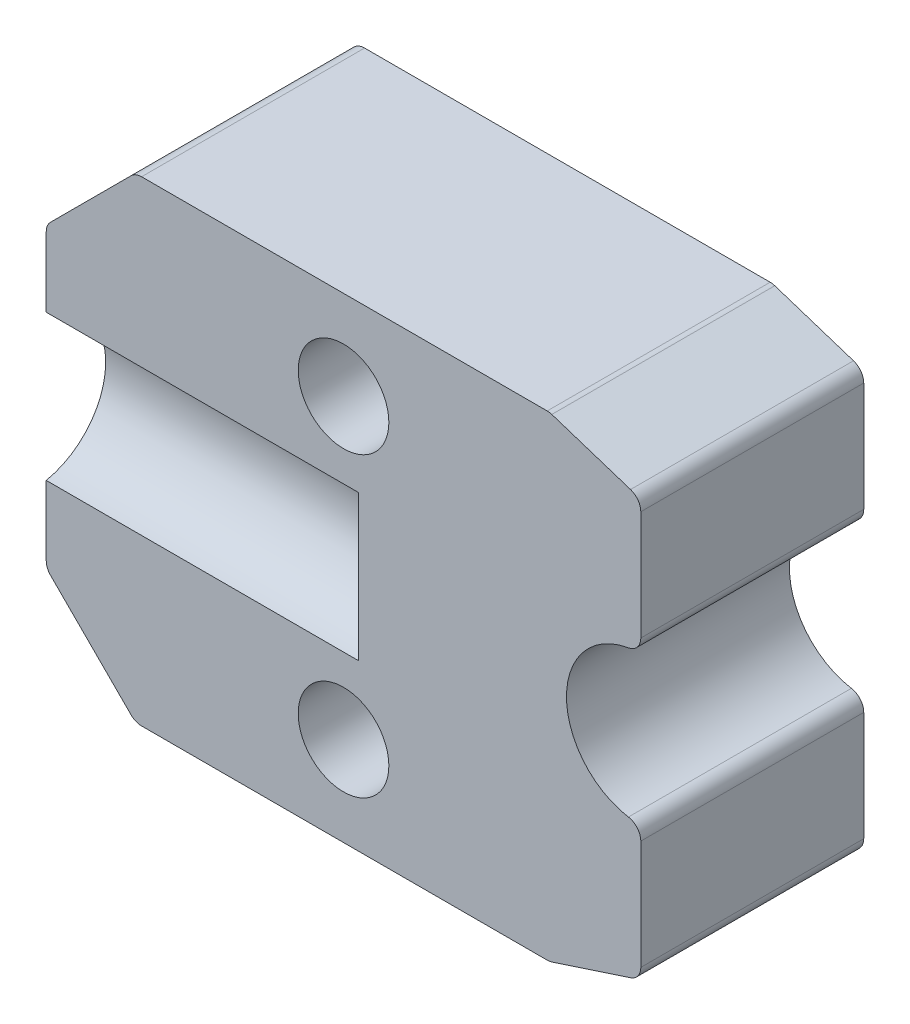
ISO-10303-21;
HEADER;
FILE_DESCRIPTION(('STEP AP214'),'2;1');
FILE_NAME('part.step','',(''),(''),'','','');
FILE_SCHEMA(('AUTOMOTIVE_DESIGN { 1 0 10303 214 1 1 1 1 }'));
ENDSEC;
DATA;
#1=APPLICATION_CONTEXT('core data for automotive mechanical design processes');
#2=APPLICATION_PROTOCOL_DEFINITION('international standard','automotive_design',2000,#1);
#3=PRODUCT_CONTEXT('',#1,'mechanical');
#4=PRODUCT('Part','Part','',(#3));
#5=PRODUCT_RELATED_PRODUCT_CATEGORY('part','',(#4));
#6=PRODUCT_DEFINITION_FORMATION('','',#4);
#7=PRODUCT_DEFINITION_CONTEXT('part definition',#1,'design');
#8=PRODUCT_DEFINITION('design','',#6,#7);
#9=PRODUCT_DEFINITION_SHAPE('','',#8);
#10=(LENGTH_UNIT() NAMED_UNIT(*) SI_UNIT(.MILLI.,.METRE.));
#11=(NAMED_UNIT(*) PLANE_ANGLE_UNIT() SI_UNIT($,.RADIAN.));
#12=(NAMED_UNIT(*) SI_UNIT($,.STERADIAN.) SOLID_ANGLE_UNIT());
#13=UNCERTAINTY_MEASURE_WITH_UNIT(LENGTH_MEASURE(1.E-05),#10,'distance_accuracy_value','');
#14=(GEOMETRIC_REPRESENTATION_CONTEXT(3) GLOBAL_UNCERTAINTY_ASSIGNED_CONTEXT((#13)) GLOBAL_UNIT_ASSIGNED_CONTEXT((#10,
#11,#12)) REPRESENTATION_CONTEXT('',''));
#15=CARTESIAN_POINT('',(0.,0.,0.));
#16=DIRECTION('',(0.,0.,1.));
#17=DIRECTION('',(1.,0.,0.));
#18=AXIS2_PLACEMENT_3D('',#15,#16,#17);
#19=CARTESIAN_POINT('',(10.,-7.,3.75));
#20=DIRECTION('',(-1.,0.,0.));
#21=DIRECTION('',(0.,0.,1.));
#22=AXIS2_PLACEMENT_3D('',#19,#20,#21);
#23=PLANE('',#22);
#24=DIRECTION('',(0.,1.,0.));
#25=VECTOR('',#24,1.);
#26=CARTESIAN_POINT('',(10.,-7.,-3.75));
#27=LINE('',#26,#25);
#28=CARTESIAN_POINT('',(10.,2.95803989154981,-3.75));
#29=VERTEX_POINT('',#28);
#30=CARTESIAN_POINT('',(10.,6.63706018608948,-3.75));
#31=VERTEX_POINT('',#30);
#32=EDGE_CURVE('E248',#29,#31,#27,.T.);
#33=ORIENTED_EDGE('',*,*,#32,.T.);
#34=DIRECTION('',(0.,0.,-1.));
#35=VECTOR('',#34,1.);
#36=CARTESIAN_POINT('',(10.,6.63706018608948,3.75));
#37=LINE('',#36,#35);
#38=CARTESIAN_POINT('',(10.,6.63706018608948,3.75));
#39=VERTEX_POINT('',#38);
#40=EDGE_CURVE('E299',#31,#39,#37,.F.);
#41=ORIENTED_EDGE('',*,*,#40,.T.);
#42=DIRECTION('',(0.,1.,0.));
#43=VECTOR('',#42,1.);
#44=CARTESIAN_POINT('',(10.,-7.,3.75));
#45=LINE('',#44,#43);
#46=CARTESIAN_POINT('',(10.,2.95803989154981,3.75));
#47=VERTEX_POINT('',#46);
#48=EDGE_CURVE('E232',#47,#39,#45,.T.);
#49=ORIENTED_EDGE('',*,*,#48,.F.);
#50=DIRECTION('',(0.,0.,-1.));
#51=VECTOR('',#50,1.);
#52=CARTESIAN_POINT('',(10.,2.95803989154981,3.75));
#53=LINE('',#52,#51);
#54=EDGE_CURVE('E296',#47,#29,#53,.T.);
#55=ORIENTED_EDGE('',*,*,#54,.T.);
#56=EDGE_LOOP('',(#33,#41,#49,#55));
#57=FACE_BOUND('',#56,.T.);
#58=ADVANCED_FACE('F37',(#57),#23,.F.);
#59=CARTESIAN_POINT('',(0.,0.,3.75));
#60=DIRECTION('',(0.,0.,1.));
#61=DIRECTION('',(1.,0.,0.));
#62=AXIS2_PLACEMENT_3D('',#59,#60,#61);
#63=PLANE('',#62);
#64=ORIENTED_EDGE('',*,*,#48,.T.);
#65=CARTESIAN_POINT('',(9.5,6.63706018608948,3.75));
#66=DIRECTION('',(0.,0.,1.));
#67=DIRECTION('',(1.,0.,0.));
#68=AXIS2_PLACEMENT_3D('',#65,#66,#67);
#69=CIRCLE('',#68,0.5);
#70=CARTESIAN_POINT('',(9.65492120752581,7.11245414846042,3.75));
#71=VERTEX_POINT('',#70);
#72=EDGE_CURVE('E317',#39,#71,#69,.T.);
#73=ORIENTED_EDGE('',*,*,#72,.T.);
#74=DIRECTION('',(-0.950787924741883,0.309842415051623,0.));
#75=VECTOR('',#74,1.);
#76=CARTESIAN_POINT('',(10.,7.,3.75));
#77=LINE('',#76,#75);
#78=CARTESIAN_POINT('',(7.00688880463988,7.97539396237094,3.75));
#79=VERTEX_POINT('',#78);
#80=EDGE_CURVE('E235',#71,#79,#77,.T.);
#81=ORIENTED_EDGE('',*,*,#80,.T.);
#82=CARTESIAN_POINT('',(6.85196759711407,7.5,3.75));
#83=DIRECTION('',(0.,0.,1.));
#84=DIRECTION('',(1.,0.,0.));
#85=AXIS2_PLACEMENT_3D('',#82,#83,#84);
#86=CIRCLE('',#85,0.5);
#87=CARTESIAN_POINT('',(6.85196759711407,8.,3.75));
#88=VERTEX_POINT('',#87);
#89=EDGE_CURVE('E315',#79,#88,#86,.T.);
#90=ORIENTED_EDGE('',*,*,#89,.T.);
#91=DIRECTION('',(-1.,0.,0.));
#92=VECTOR('',#91,1.);
#93=CARTESIAN_POINT('',(6.93138228159153,8.,3.75));
#94=LINE('',#93,#92);
#95=CARTESIAN_POINT('',(-6.79289321881344,8.,3.75));
#96=VERTEX_POINT('',#95);
#97=EDGE_CURVE('E238',#88,#96,#94,.T.);
#98=ORIENTED_EDGE('',*,*,#97,.T.);
#99=CARTESIAN_POINT('',(-6.79289321881344,7.5,3.75));
#100=DIRECTION('',(0.,0.,1.));
#101=DIRECTION('',(1.,0.,0.));
#102=AXIS2_PLACEMENT_3D('',#99,#100,#101);
#103=CIRCLE('',#102,0.5);
#104=CARTESIAN_POINT('',(-7.14644660940671,7.85355339059327,3.75));
#105=VERTEX_POINT('',#104);
#106=EDGE_CURVE('E313',#96,#105,#103,.T.);
#107=ORIENTED_EDGE('',*,*,#106,.T.);
#108=DIRECTION('',(0.707106781186549,0.707106781186546,0.));
#109=VECTOR('',#108,1.);
#110=CARTESIAN_POINT('',(-7.49999999999998,7.50000000000001,3.75));
#111=LINE('',#110,#109);
#112=CARTESIAN_POINT('',(-9.85355339059327,5.14644660940673,3.75));
#113=VERTEX_POINT('',#112);
#114=EDGE_CURVE('E265',#105,#113,#111,.F.);
#115=ORIENTED_EDGE('',*,*,#114,.T.);
#116=CARTESIAN_POINT('',(-9.5,4.79289321881345,3.75));
#117=DIRECTION('',(0.,0.,1.));
#118=DIRECTION('',(1.,0.,0.));
#119=AXIS2_PLACEMENT_3D('',#116,#117,#118);
#120=CIRCLE('',#119,0.5);
#121=CARTESIAN_POINT('',(-10.,4.79289321881345,3.75));
#122=VERTEX_POINT('',#121);
#123=EDGE_CURVE('E311',#113,#122,#120,.T.);
#124=ORIENTED_EDGE('',*,*,#123,.T.);
#125=DIRECTION('',(0.,-1.,0.));
#126=VECTOR('',#125,1.);
#127=CARTESIAN_POINT('',(-10.,8.,3.75));
#128=LINE('',#127,#126);
#129=CARTESIAN_POINT('',(-10.,2.44948974278318,3.75));
#130=VERTEX_POINT('',#129);
#131=EDGE_CURVE('E195',#122,#130,#128,.T.);
#132=ORIENTED_EDGE('',*,*,#131,.T.);
#133=DIRECTION('',(-1.,0.,0.));
#134=VECTOR('',#133,1.);
#135=CARTESIAN_POINT('',(0.5,2.44948974278318,3.75));
#136=LINE('',#135,#134);
#137=CARTESIAN_POINT('',(0.5,2.44948974278318,3.75));
#138=VERTEX_POINT('',#137);
#139=EDGE_CURVE('E200',#138,#130,#136,.T.);
#140=ORIENTED_EDGE('',*,*,#139,.F.);
#141=DIRECTION('',(0.,-1.,0.));
#142=VECTOR('',#141,1.);
#143=CARTESIAN_POINT('',(0.5,0.,3.75));
#144=LINE('',#143,#142);
#145=CARTESIAN_POINT('',(0.500000000000001,-2.44948974278318,3.75));
#146=VERTEX_POINT('',#145);
#147=EDGE_CURVE('E188',#138,#146,#144,.T.);
#148=ORIENTED_EDGE('',*,*,#147,.T.);
#149=DIRECTION('',(-1.,0.,0.));
#150=VECTOR('',#149,1.);
#151=CARTESIAN_POINT('',(0.500000000000001,-2.44948974278317,3.75));
#152=LINE('',#151,#150);
#153=CARTESIAN_POINT('',(-10.,-2.44948974278318,3.75));
#154=VERTEX_POINT('',#153);
#155=EDGE_CURVE('E202',#154,#146,#152,.F.);
#156=ORIENTED_EDGE('',*,*,#155,.F.);
#157=CARTESIAN_POINT('',(-10.,-4.79289321881345,3.75));
#158=VERTEX_POINT('',#157);
#159=EDGE_CURVE('E241',#154,#158,#128,.T.);
#160=ORIENTED_EDGE('',*,*,#159,.T.);
#161=CARTESIAN_POINT('',(-9.5,-4.79289321881345,3.75));
#162=DIRECTION('',(0.,0.,1.));
#163=DIRECTION('',(1.,0.,0.));
#164=AXIS2_PLACEMENT_3D('',#161,#162,#163);
#165=CIRCLE('',#164,0.5);
#166=CARTESIAN_POINT('',(-9.85355339059327,-5.14644660940672,3.75));
#167=VERTEX_POINT('',#166);
#168=EDGE_CURVE('E309',#158,#167,#165,.T.);
#169=ORIENTED_EDGE('',*,*,#168,.T.);
#170=DIRECTION('',(-0.707106781186546,0.707106781186549,0.));
#171=VECTOR('',#170,1.);
#172=CARTESIAN_POINT('',(-7.50000000000002,-7.49999999999998,3.75));
#173=LINE('',#172,#171);
#174=CARTESIAN_POINT('',(-7.14644660940673,-7.85355339059327,3.75));
#175=VERTEX_POINT('',#174);
#176=EDGE_CURVE('E268',#167,#175,#173,.F.);
#177=ORIENTED_EDGE('',*,*,#176,.T.);
#178=CARTESIAN_POINT('',(-6.79289321881346,-7.5,3.75));
#179=DIRECTION('',(0.,0.,1.));
#180=DIRECTION('',(1.,0.,0.));
#181=AXIS2_PLACEMENT_3D('',#178,#179,#180);
#182=CIRCLE('',#181,0.5);
#183=CARTESIAN_POINT('',(-6.79289321881346,-8.,3.75));
#184=VERTEX_POINT('',#183);
#185=EDGE_CURVE('E307',#175,#184,#182,.T.);
#186=ORIENTED_EDGE('',*,*,#185,.T.);
#187=DIRECTION('',(1.,0.,0.));
#188=VECTOR('',#187,1.);
#189=CARTESIAN_POINT('',(-10.,-8.,3.75));
#190=LINE('',#189,#188);
#191=CARTESIAN_POINT('',(6.85196759711407,-8.,3.75));
#192=VERTEX_POINT('',#191);
#193=EDGE_CURVE('E226',#184,#192,#190,.T.);
#194=ORIENTED_EDGE('',*,*,#193,.T.);
#195=CARTESIAN_POINT('',(6.85196759711407,-7.5,3.75));
#196=DIRECTION('',(0.,0.,1.));
#197=DIRECTION('',(1.,0.,0.));
#198=AXIS2_PLACEMENT_3D('',#195,#196,#197);
#199=CIRCLE('',#198,0.5);
#200=CARTESIAN_POINT('',(7.00688880463989,-7.97539396237094,3.75));
#201=VERTEX_POINT('',#200);
#202=EDGE_CURVE('E305',#192,#201,#199,.T.);
#203=ORIENTED_EDGE('',*,*,#202,.T.);
#204=DIRECTION('',(0.950787924741883,0.309842415051624,0.));
#205=VECTOR('',#204,1.);
#206=CARTESIAN_POINT('',(6.93138228159153,-8.,3.75));
#207=LINE('',#206,#205);
#208=CARTESIAN_POINT('',(9.65492120752581,-7.11245414846042,3.75));
#209=VERTEX_POINT('',#208);
#210=EDGE_CURVE('E229',#201,#209,#207,.T.);
#211=ORIENTED_EDGE('',*,*,#210,.T.);
#212=CARTESIAN_POINT('',(9.5,-6.63706018608948,3.75));
#213=DIRECTION('',(0.,0.,1.));
#214=DIRECTION('',(1.,0.,0.));
#215=AXIS2_PLACEMENT_3D('',#212,#213,#214);
#216=CIRCLE('',#215,0.5);
#217=CARTESIAN_POINT('',(10.,-6.63706018608948,3.75));
#218=VERTEX_POINT('',#217);
#219=EDGE_CURVE('E60',#209,#218,#216,.T.);
#220=ORIENTED_EDGE('',*,*,#219,.T.);
#221=CARTESIAN_POINT('',(10.,-2.95803989154981,3.75));
#222=VERTEX_POINT('',#221);
#223=EDGE_CURVE('E233',#218,#222,#45,.T.);
#224=ORIENTED_EDGE('',*,*,#223,.T.);
#225=CARTESIAN_POINT('',(9.5,-2.95803989154981,3.75));
#226=DIRECTION('',(0.,0.,1.));
#227=DIRECTION('',(1.,0.,0.));
#228=AXIS2_PLACEMENT_3D('',#225,#226,#227);
#229=CIRCLE('',#228,0.5);
#230=CARTESIAN_POINT('',(9.58333333333333,-2.46503324295817,3.75));
#231=VERTEX_POINT('',#230);
#232=EDGE_CURVE('E52',#222,#231,#229,.T.);
#233=ORIENTED_EDGE('',*,*,#232,.T.);
#234=CARTESIAN_POINT('',(10.,0.,3.75));
#235=DIRECTION('',(0.,0.,-1.));
#236=DIRECTION('',(-1.,0.,0.));
#237=AXIS2_PLACEMENT_3D('',#234,#235,#236);
#238=CIRCLE('',#237,2.5);
#239=CARTESIAN_POINT('',(9.58333333333333,2.46503324295817,3.75));
#240=VERTEX_POINT('',#239);
#241=EDGE_CURVE('E361',#231,#240,#238,.T.);
#242=ORIENTED_EDGE('',*,*,#241,.T.);
#243=CARTESIAN_POINT('',(9.5,2.95803989154981,3.75));
#244=DIRECTION('',(0.,0.,1.));
#245=DIRECTION('',(1.,0.,0.));
#246=AXIS2_PLACEMENT_3D('',#243,#244,#245);
#247=CIRCLE('',#246,0.5);
#248=EDGE_CURVE('E302',#240,#47,#247,.T.);
#249=ORIENTED_EDGE('',*,*,#248,.T.);
#250=EDGE_LOOP('',(#64,#73,#81,#90,#98,#107,#115,#124,#132,#140,#148,#156,#160,#169,#177,#186,
#194,#203,#211,#220,#224,#233,#242,#249));
#251=FACE_BOUND('',#250,.T.);
#252=CARTESIAN_POINT('',(0.,5.,3.75));
#253=DIRECTION('',(0.,0.,1.));
#254=DIRECTION('',(1.,0.,0.));
#255=AXIS2_PLACEMENT_3D('',#252,#253,#254);
#256=CIRCLE('',#255,1.525);
#257=CARTESIAN_POINT('',(1.525,5.,3.75));
#258=VERTEX_POINT('',#257);
#259=EDGE_CURVE('E220',#258,#258,#256,.T.);
#260=ORIENTED_EDGE('',*,*,#259,.F.);
#261=EDGE_LOOP('',(#260));
#262=FACE_BOUND('',#261,.T.);
#263=CARTESIAN_POINT('',(0.,-5.,3.75));
#264=DIRECTION('',(0.,0.,1.));
#265=DIRECTION('',(1.,0.,0.));
#266=AXIS2_PLACEMENT_3D('',#263,#264,#265);
#267=CIRCLE('',#266,1.525);
#268=CARTESIAN_POINT('',(1.525,-5.,3.75));
#269=VERTEX_POINT('',#268);
#270=EDGE_CURVE('E212',#269,#269,#267,.T.);
#271=ORIENTED_EDGE('',*,*,#270,.F.);
#272=EDGE_LOOP('',(#271));
#273=FACE_BOUND('',#272,.T.);
#274=ADVANCED_FACE('F206',(#251,#262,#273),#63,.T.);
#275=CARTESIAN_POINT('',(0.,0.,-3.75));
#276=DIRECTION('',(0.,0.,1.));
#277=DIRECTION('',(1.,0.,0.));
#278=AXIS2_PLACEMENT_3D('',#275,#276,#277);
#279=PLANE('',#278);
#280=DIRECTION('',(-0.950787924741883,0.309842415051623,0.));
#281=VECTOR('',#280,1.);
#282=CARTESIAN_POINT('',(10.,7.,-3.75));
#283=LINE('',#282,#281);
#284=CARTESIAN_POINT('',(9.65492120752581,7.11245414846042,-3.75));
#285=VERTEX_POINT('',#284);
#286=CARTESIAN_POINT('',(7.00688880463988,7.97539396237094,-3.75));
#287=VERTEX_POINT('',#286);
#288=EDGE_CURVE('E252',#285,#287,#283,.T.);
#289=ORIENTED_EDGE('',*,*,#288,.F.);
#290=CARTESIAN_POINT('',(9.5,6.63706018608948,-3.75));
#291=DIRECTION('',(0.,0.,1.));
#292=DIRECTION('',(1.,0.,0.));
#293=AXIS2_PLACEMENT_3D('',#290,#291,#292);
#294=CIRCLE('',#293,0.5);
#295=EDGE_CURVE('E294',#285,#31,#294,.F.);
#296=ORIENTED_EDGE('',*,*,#295,.T.);
#297=ORIENTED_EDGE('',*,*,#32,.F.);
#298=CARTESIAN_POINT('',(9.5,2.95803989154981,-3.75));
#299=DIRECTION('',(0.,0.,1.));
#300=DIRECTION('',(1.,0.,0.));
#301=AXIS2_PLACEMENT_3D('',#298,#299,#300);
#302=CIRCLE('',#301,0.5);
#303=CARTESIAN_POINT('',(9.58333333333333,2.46503324295817,-3.75));
#304=VERTEX_POINT('',#303);
#305=EDGE_CURVE('E278',#29,#304,#302,.F.);
#306=ORIENTED_EDGE('',*,*,#305,.T.);
#307=CARTESIAN_POINT('',(10.,0.,-3.75));
#308=DIRECTION('',(0.,0.,-1.));
#309=DIRECTION('',(-1.,0.,0.));
#310=AXIS2_PLACEMENT_3D('',#307,#308,#309);
#311=CIRCLE('',#310,2.5);
#312=CARTESIAN_POINT('',(9.58333333333333,-2.46503324295817,-3.75));
#313=VERTEX_POINT('',#312);
#314=EDGE_CURVE('E358',#313,#304,#311,.T.);
#315=ORIENTED_EDGE('',*,*,#314,.F.);
#316=CARTESIAN_POINT('',(9.5,-2.95803989154981,-3.75));
#317=DIRECTION('',(0.,0.,1.));
#318=DIRECTION('',(1.,0.,0.));
#319=AXIS2_PLACEMENT_3D('',#316,#317,#318);
#320=CIRCLE('',#319,0.5);
#321=CARTESIAN_POINT('',(10.,-2.95803989154981,-3.75));
#322=VERTEX_POINT('',#321);
#323=EDGE_CURVE('E276',#313,#322,#320,.F.);
#324=ORIENTED_EDGE('',*,*,#323,.T.);
#325=CARTESIAN_POINT('',(10.,-6.63706018608948,-3.75));
#326=VERTEX_POINT('',#325);
#327=EDGE_CURVE('E249',#326,#322,#27,.T.);
#328=ORIENTED_EDGE('',*,*,#327,.F.);
#329=CARTESIAN_POINT('',(9.5,-6.63706018608948,-3.75));
#330=DIRECTION('',(0.,0.,1.));
#331=DIRECTION('',(1.,0.,0.));
#332=AXIS2_PLACEMENT_3D('',#329,#330,#331);
#333=CIRCLE('',#332,0.5);
#334=CARTESIAN_POINT('',(9.65492120752581,-7.11245414846042,-3.75));
#335=VERTEX_POINT('',#334);
#336=EDGE_CURVE('E280',#326,#335,#333,.F.);
#337=ORIENTED_EDGE('',*,*,#336,.T.);
#338=DIRECTION('',(0.950787924741883,0.309842415051624,0.));
#339=VECTOR('',#338,1.);
#340=CARTESIAN_POINT('',(6.93138228159153,-8.,-3.75));
#341=LINE('',#340,#339);
#342=CARTESIAN_POINT('',(7.00688880463989,-7.97539396237094,-3.75));
#343=VERTEX_POINT('',#342);
#344=EDGE_CURVE('E245',#343,#335,#341,.T.);
#345=ORIENTED_EDGE('',*,*,#344,.F.);
#346=CARTESIAN_POINT('',(6.85196759711407,-7.5,-3.75));
#347=DIRECTION('',(0.,0.,1.));
#348=DIRECTION('',(1.,0.,0.));
#349=AXIS2_PLACEMENT_3D('',#346,#347,#348);
#350=CIRCLE('',#349,0.5);
#351=CARTESIAN_POINT('',(6.85196759711407,-8.,-3.75));
#352=VERTEX_POINT('',#351);
#353=EDGE_CURVE('E282',#343,#352,#350,.F.);
#354=ORIENTED_EDGE('',*,*,#353,.T.);
#355=DIRECTION('',(1.,0.,0.));
#356=VECTOR('',#355,1.);
#357=CARTESIAN_POINT('',(-10.,-8.,-3.75));
#358=LINE('',#357,#356);
#359=CARTESIAN_POINT('',(-6.79289321881346,-8.,-3.75));
#360=VERTEX_POINT('',#359);
#361=EDGE_CURVE('E223',#360,#352,#358,.T.);
#362=ORIENTED_EDGE('',*,*,#361,.F.);
#363=CARTESIAN_POINT('',(-6.79289321881346,-7.5,-3.75));
#364=DIRECTION('',(0.,0.,1.));
#365=DIRECTION('',(1.,0.,0.));
#366=AXIS2_PLACEMENT_3D('',#363,#364,#365);
#367=CIRCLE('',#366,0.5);
#368=CARTESIAN_POINT('',(-7.14644660940673,-7.85355339059327,-3.75));
#369=VERTEX_POINT('',#368);
#370=EDGE_CURVE('E284',#360,#369,#367,.F.);
#371=ORIENTED_EDGE('',*,*,#370,.T.);
#372=DIRECTION('',(0.707106781186546,-0.707106781186549,0.));
#373=VECTOR('',#372,1.);
#374=CARTESIAN_POINT('',(-7.,-8.,-3.75));
#375=LINE('',#374,#373);
#376=CARTESIAN_POINT('',(-9.85355339059327,-5.14644660940672,-3.75));
#377=VERTEX_POINT('',#376);
#378=EDGE_CURVE('E262',#369,#377,#375,.F.);
#379=ORIENTED_EDGE('',*,*,#378,.T.);
#380=CARTESIAN_POINT('',(-9.5,-4.79289321881345,-3.75));
#381=DIRECTION('',(0.,0.,1.));
#382=DIRECTION('',(1.,0.,0.));
#383=AXIS2_PLACEMENT_3D('',#380,#381,#382);
#384=CIRCLE('',#383,0.5);
#385=CARTESIAN_POINT('',(-10.,-4.79289321881345,-3.75));
#386=VERTEX_POINT('',#385);
#387=EDGE_CURVE('E286',#377,#386,#384,.F.);
#388=ORIENTED_EDGE('',*,*,#387,.T.);
#389=DIRECTION('',(0.,-1.,0.));
#390=VECTOR('',#389,1.);
#391=CARTESIAN_POINT('',(-10.,8.,-3.75));
#392=LINE('',#391,#390);
#393=CARTESIAN_POINT('',(-10.,4.79289321881345,-3.75));
#394=VERTEX_POINT('',#393);
#395=EDGE_CURVE('E230',#394,#386,#392,.T.);
#396=ORIENTED_EDGE('',*,*,#395,.F.);
#397=CARTESIAN_POINT('',(-9.5,4.79289321881345,-3.75));
#398=DIRECTION('',(0.,0.,1.));
#399=DIRECTION('',(1.,0.,0.));
#400=AXIS2_PLACEMENT_3D('',#397,#398,#399);
#401=CIRCLE('',#400,0.5);
#402=CARTESIAN_POINT('',(-9.85355339059327,5.14644660940673,-3.75));
#403=VERTEX_POINT('',#402);
#404=EDGE_CURVE('E288',#394,#403,#401,.F.);
#405=ORIENTED_EDGE('',*,*,#404,.T.);
#406=DIRECTION('',(-0.707106781186549,-0.707106781186546,0.));
#407=VECTOR('',#406,1.);
#408=CARTESIAN_POINT('',(-10.,5.,-3.75));
#409=LINE('',#408,#407);
#410=CARTESIAN_POINT('',(-7.14644660940671,7.85355339059327,-3.75));
#411=VERTEX_POINT('',#410);
#412=EDGE_CURVE('E194',#403,#411,#409,.F.);
#413=ORIENTED_EDGE('',*,*,#412,.T.);
#414=CARTESIAN_POINT('',(-6.79289321881344,7.5,-3.75));
#415=DIRECTION('',(0.,0.,1.));
#416=DIRECTION('',(1.,0.,0.));
#417=AXIS2_PLACEMENT_3D('',#414,#415,#416);
#418=CIRCLE('',#417,0.5);
#419=CARTESIAN_POINT('',(-6.79289321881344,8.,-3.75));
#420=VERTEX_POINT('',#419);
#421=EDGE_CURVE('E290',#411,#420,#418,.F.);
#422=ORIENTED_EDGE('',*,*,#421,.T.);
#423=DIRECTION('',(-1.,0.,0.));
#424=VECTOR('',#423,1.);
#425=CARTESIAN_POINT('',(6.93138228159153,8.,-3.75));
#426=LINE('',#425,#424);
#427=CARTESIAN_POINT('',(6.85196759711407,8.,-3.75));
#428=VERTEX_POINT('',#427);
#429=EDGE_CURVE('E255',#428,#420,#426,.T.);
#430=ORIENTED_EDGE('',*,*,#429,.F.);
#431=CARTESIAN_POINT('',(6.85196759711407,7.5,-3.75));
#432=DIRECTION('',(0.,0.,1.));
#433=DIRECTION('',(1.,0.,0.));
#434=AXIS2_PLACEMENT_3D('',#431,#432,#433);
#435=CIRCLE('',#434,0.5);
#436=EDGE_CURVE('E292',#428,#287,#435,.F.);
#437=ORIENTED_EDGE('',*,*,#436,.T.);
#438=EDGE_LOOP('',(#289,#296,#297,#306,#315,#324,#328,#337,#345,#354,#362,#371,#379,#388,#396,
#405,#413,#422,#430,#437));
#439=FACE_BOUND('',#438,.T.);
#440=CARTESIAN_POINT('',(0.,5.,-3.75));
#441=DIRECTION('',(0.,0.,1.));
#442=DIRECTION('',(1.,0.,0.));
#443=AXIS2_PLACEMENT_3D('',#440,#441,#442);
#444=CIRCLE('',#443,1.525);
#445=CARTESIAN_POINT('',(1.525,5.,-3.75));
#446=VERTEX_POINT('',#445);
#447=EDGE_CURVE('E218',#446,#446,#444,.T.);
#448=ORIENTED_EDGE('',*,*,#447,.T.);
#449=EDGE_LOOP('',(#448));
#450=FACE_BOUND('',#449,.T.);
#451=CARTESIAN_POINT('',(0.,-5.,-3.75));
#452=DIRECTION('',(0.,0.,1.));
#453=DIRECTION('',(1.,0.,0.));
#454=AXIS2_PLACEMENT_3D('',#451,#452,#453);
#455=CIRCLE('',#454,1.525);
#456=CARTESIAN_POINT('',(1.525,-5.,-3.75));
#457=VERTEX_POINT('',#456);
#458=EDGE_CURVE('E209',#457,#457,#455,.T.);
#459=ORIENTED_EDGE('',*,*,#458,.T.);
#460=EDGE_LOOP('',(#459));
#461=FACE_BOUND('',#460,.T.);
#462=ADVANCED_FACE('F365',(#439,#450,#461),#279,.F.);
#463=CARTESIAN_POINT('',(-10.,-8.,3.75));
#464=DIRECTION('',(0.,1.,0.));
#465=DIRECTION('',(0.,0.,1.));
#466=AXIS2_PLACEMENT_3D('',#463,#464,#465);
#467=PLANE('',#466);
#468=ORIENTED_EDGE('',*,*,#193,.F.);
#469=DIRECTION('',(0.,0.,1.));
#470=VECTOR('',#469,1.);
#471=CARTESIAN_POINT('',(-6.79289321881346,-8.,-3.75));
#472=LINE('',#471,#470);
#473=EDGE_CURVE('E341',#184,#360,#472,.F.);
#474=ORIENTED_EDGE('',*,*,#473,.T.);
#475=ORIENTED_EDGE('',*,*,#361,.T.);
#476=DIRECTION('',(0.,0.,-1.));
#477=VECTOR('',#476,1.);
#478=CARTESIAN_POINT('',(6.85196759711407,-8.,3.75));
#479=LINE('',#478,#477);
#480=EDGE_CURVE('E339',#352,#192,#479,.F.);
#481=ORIENTED_EDGE('',*,*,#480,.T.);
#482=EDGE_LOOP('',(#468,#474,#475,#481));
#483=FACE_BOUND('',#482,.T.);
#484=ADVANCED_FACE('F435',(#483),#467,.F.);
#485=CARTESIAN_POINT('',(6.93138228159153,-8.,3.75));
#486=DIRECTION('',(-0.309842415051624,0.950787924741883,0.));
#487=DIRECTION('',(-0.950787924741883,-0.309842415051624,0.));
#488=AXIS2_PLACEMENT_3D('',#485,#486,#487);
#489=PLANE('',#488);
#490=ORIENTED_EDGE('',*,*,#210,.F.);
#491=DIRECTION('',(0.,0.,-1.));
#492=VECTOR('',#491,1.);
#493=CARTESIAN_POINT('',(7.00688880463989,-7.97539396237094,3.75));
#494=LINE('',#493,#492);
#495=EDGE_CURVE('E346',#201,#343,#494,.T.);
#496=ORIENTED_EDGE('',*,*,#495,.T.);
#497=ORIENTED_EDGE('',*,*,#344,.T.);
#498=DIRECTION('',(0.,0.,-1.));
#499=VECTOR('',#498,1.);
#500=CARTESIAN_POINT('',(9.65492120752581,-7.11245414846042,3.75));
#501=LINE('',#500,#499);
#502=EDGE_CURVE('E344',#335,#209,#501,.F.);
#503=ORIENTED_EDGE('',*,*,#502,.T.);
#504=EDGE_LOOP('',(#490,#496,#497,#503));
#505=FACE_BOUND('',#504,.T.);
#506=ADVANCED_FACE('F442',(#505),#489,.F.);
#507=ORIENTED_EDGE('',*,*,#223,.F.);
#508=DIRECTION('',(0.,0.,-1.));
#509=VECTOR('',#508,1.);
#510=CARTESIAN_POINT('',(10.,-6.63706018608948,3.75));
#511=LINE('',#510,#509);
#512=EDGE_CURVE('E351',#218,#326,#511,.T.);
#513=ORIENTED_EDGE('',*,*,#512,.T.);
#514=ORIENTED_EDGE('',*,*,#327,.T.);
#515=DIRECTION('',(0.,0.,-1.));
#516=VECTOR('',#515,1.);
#517=CARTESIAN_POINT('',(10.,-2.95803989154981,3.75));
#518=LINE('',#517,#516);
#519=EDGE_CURVE('E349',#322,#222,#518,.F.);
#520=ORIENTED_EDGE('',*,*,#519,.T.);
#521=EDGE_LOOP('',(#507,#513,#514,#520));
#522=FACE_BOUND('',#521,.T.);
#523=ADVANCED_FACE('F371',(#522),#23,.F.);
#524=CARTESIAN_POINT('',(10.,7.,3.75));
#525=DIRECTION('',(-0.309842415051623,-0.950787924741884,0.));
#526=DIRECTION('',(0.950787924741884,-0.309842415051623,0.));
#527=AXIS2_PLACEMENT_3D('',#524,#525,#526);
#528=PLANE('',#527);
#529=ORIENTED_EDGE('',*,*,#80,.F.);
#530=DIRECTION('',(0.,0.,-1.));
#531=VECTOR('',#530,1.);
#532=CARTESIAN_POINT('',(9.65492120752581,7.11245414846042,3.75));
#533=LINE('',#532,#531);
#534=EDGE_CURVE('E273',#71,#285,#533,.T.);
#535=ORIENTED_EDGE('',*,*,#534,.T.);
#536=ORIENTED_EDGE('',*,*,#288,.T.);
#537=DIRECTION('',(0.,0.,-1.));
#538=VECTOR('',#537,1.);
#539=CARTESIAN_POINT('',(7.00688880463988,7.97539396237094,3.75));
#540=LINE('',#539,#538);
#541=EDGE_CURVE('E271',#287,#79,#540,.F.);
#542=ORIENTED_EDGE('',*,*,#541,.T.);
#543=EDGE_LOOP('',(#529,#535,#536,#542));
#544=FACE_BOUND('',#543,.T.);
#545=ADVANCED_FACE('F388',(#544),#528,.F.);
#546=CARTESIAN_POINT('',(6.93138228159153,8.,3.75));
#547=DIRECTION('',(0.,-1.,0.));
#548=DIRECTION('',(1.,0.,0.));
#549=AXIS2_PLACEMENT_3D('',#546,#547,#548);
#550=PLANE('',#549);
#551=ORIENTED_EDGE('',*,*,#97,.F.);
#552=DIRECTION('',(0.,0.,-1.));
#553=VECTOR('',#552,1.);
#554=CARTESIAN_POINT('',(6.85196759711407,8.,3.75));
#555=LINE('',#554,#553);
#556=EDGE_CURVE('E322',#88,#428,#555,.T.);
#557=ORIENTED_EDGE('',*,*,#556,.T.);
#558=ORIENTED_EDGE('',*,*,#429,.T.);
#559=DIRECTION('',(0.,0.,-1.));
#560=VECTOR('',#559,1.);
#561=CARTESIAN_POINT('',(-6.79289321881344,8.,3.75));
#562=LINE('',#561,#560);
#563=EDGE_CURVE('E319',#420,#96,#562,.F.);
#564=ORIENTED_EDGE('',*,*,#563,.T.);
#565=EDGE_LOOP('',(#551,#557,#558,#564));
#566=FACE_BOUND('',#565,.T.);
#567=ADVANCED_FACE('F397',(#566),#550,.F.);
#568=CARTESIAN_POINT('',(-10.,8.,3.75));
#569=DIRECTION('',(1.,0.,0.));
#570=DIRECTION('',(0.,1.,0.));
#571=AXIS2_PLACEMENT_3D('',#568,#569,#570);
#572=PLANE('',#571);
#573=ORIENTED_EDGE('',*,*,#131,.F.);
#574=DIRECTION('',(0.,0.,1.));
#575=VECTOR('',#574,1.);
#576=CARTESIAN_POINT('',(-10.,4.79289321881345,-3.75));
#577=LINE('',#576,#575);
#578=EDGE_CURVE('E332',#122,#394,#577,.F.);
#579=ORIENTED_EDGE('',*,*,#578,.T.);
#580=ORIENTED_EDGE('',*,*,#395,.T.);
#581=DIRECTION('',(0.,0.,-1.));
#582=VECTOR('',#581,1.);
#583=CARTESIAN_POINT('',(-10.,-4.79289321881345,3.75));
#584=LINE('',#583,#582);
#585=EDGE_CURVE('E329',#386,#158,#584,.F.);
#586=ORIENTED_EDGE('',*,*,#585,.T.);
#587=ORIENTED_EDGE('',*,*,#159,.F.);
#588=CARTESIAN_POINT('',(-10.,0.,4.25));
#589=DIRECTION('',(-1.,0.,0.));
#590=DIRECTION('',(0.,-1.,0.));
#591=AXIS2_PLACEMENT_3D('',#588,#589,#590);
#592=CIRCLE('',#591,2.5);
#593=EDGE_CURVE('E203',#130,#154,#592,.T.);
#594=ORIENTED_EDGE('',*,*,#593,.F.);
#595=EDGE_LOOP('',(#573,#579,#580,#586,#587,#594));
#596=FACE_BOUND('',#595,.T.);
#597=ADVANCED_FACE('F413',(#596),#572,.F.);
#598=CARTESIAN_POINT('',(0.,5.,3.75));
#599=DIRECTION('',(0.,0.,-1.));
#600=DIRECTION('',(-1.,0.,0.));
#601=AXIS2_PLACEMENT_3D('',#598,#599,#600);
#602=CYLINDRICAL_SURFACE('',#601,1.525);
#603=ORIENTED_EDGE('',*,*,#259,.T.);
#604=EDGE_LOOP('',(#603));
#605=FACE_BOUND('',#604,.T.);
#606=ORIENTED_EDGE('',*,*,#447,.F.);
#607=EDGE_LOOP('',(#606));
#608=FACE_BOUND('',#607,.T.);
#609=ADVANCED_FACE('F592',(#605,#608),#602,.F.);
#610=CARTESIAN_POINT('',(0.,-5.,3.75));
#611=DIRECTION('',(0.,0.,-1.));
#612=DIRECTION('',(-1.,0.,0.));
#613=AXIS2_PLACEMENT_3D('',#610,#611,#612);
#614=CYLINDRICAL_SURFACE('',#613,1.525);
#615=ORIENTED_EDGE('',*,*,#270,.T.);
#616=EDGE_LOOP('',(#615));
#617=FACE_BOUND('',#616,.T.);
#618=ORIENTED_EDGE('',*,*,#458,.F.);
#619=EDGE_LOOP('',(#618));
#620=FACE_BOUND('',#619,.T.);
#621=ADVANCED_FACE('F584',(#617,#620),#614,.F.);
#622=CARTESIAN_POINT('',(0.5,0.,4.25));
#623=DIRECTION('',(-1.,0.,0.));
#624=DIRECTION('',(0.,-1.,0.));
#625=AXIS2_PLACEMENT_3D('',#622,#623,#624);
#626=CYLINDRICAL_SURFACE('',#625,2.5);
#627=ORIENTED_EDGE('',*,*,#139,.T.);
#628=ORIENTED_EDGE('',*,*,#593,.T.);
#629=ORIENTED_EDGE('',*,*,#155,.T.);
#630=CARTESIAN_POINT('',(0.5,0.,4.25));
#631=DIRECTION('',(-1.,0.,0.));
#632=DIRECTION('',(0.,-1.,0.));
#633=AXIS2_PLACEMENT_3D('',#630,#631,#632);
#634=CIRCLE('',#633,2.5);
#635=EDGE_CURVE('E191',#138,#146,#634,.T.);
#636=ORIENTED_EDGE('',*,*,#635,.F.);
#637=EDGE_LOOP('',(#627,#628,#629,#636));
#638=FACE_BOUND('',#637,.T.);
#639=ADVANCED_FACE('F199',(#638),#626,.F.);
#640=CARTESIAN_POINT('',(0.5,0.,4.25));
#641=DIRECTION('',(-1.,0.,0.));
#642=DIRECTION('',(0.,-1.,0.));
#643=AXIS2_PLACEMENT_3D('',#640,#641,#642);
#644=PLANE('',#643);
#645=ORIENTED_EDGE('',*,*,#635,.T.);
#646=ORIENTED_EDGE('',*,*,#147,.F.);
#647=EDGE_LOOP('',(#645,#646));
#648=FACE_BOUND('',#647,.T.);
#649=ADVANCED_FACE('F190',(#648),#644,.T.);
#650=CARTESIAN_POINT('',(-7.,-8.,3.75));
#651=DIRECTION('',(0.707106781186549,0.707106781186546,0.));
#652=DIRECTION('',(0.,0.,-1.));
#653=AXIS2_PLACEMENT_3D('',#650,#651,#652);
#654=PLANE('',#653);
#655=ORIENTED_EDGE('',*,*,#176,.F.);
#656=DIRECTION('',(0.,0.,1.));
#657=VECTOR('',#656,1.);
#658=CARTESIAN_POINT('',(-9.85355339059327,-5.14644660940672,-3.75));
#659=LINE('',#658,#657);
#660=EDGE_CURVE('E337',#167,#377,#659,.F.);
#661=ORIENTED_EDGE('',*,*,#660,.T.);
#662=ORIENTED_EDGE('',*,*,#378,.F.);
#663=DIRECTION('',(0.,0.,-1.));
#664=VECTOR('',#663,1.);
#665=CARTESIAN_POINT('',(-7.14644660940673,-7.85355339059327,3.75));
#666=LINE('',#665,#664);
#667=EDGE_CURVE('E335',#369,#175,#666,.F.);
#668=ORIENTED_EDGE('',*,*,#667,.T.);
#669=EDGE_LOOP('',(#655,#661,#662,#668));
#670=FACE_BOUND('',#669,.T.);
#671=ADVANCED_FACE('F423',(#670),#654,.F.);
#672=CARTESIAN_POINT('',(-10.,5.,3.75));
#673=DIRECTION('',(0.707106781186546,-0.707106781186549,0.));
#674=DIRECTION('',(0.,0.,-1.));
#675=AXIS2_PLACEMENT_3D('',#672,#673,#674);
#676=PLANE('',#675);
#677=ORIENTED_EDGE('',*,*,#114,.F.);
#678=DIRECTION('',(0.,0.,1.));
#679=VECTOR('',#678,1.);
#680=CARTESIAN_POINT('',(-7.14644660940672,7.85355339059327,-3.75));
#681=LINE('',#680,#679);
#682=EDGE_CURVE('E327',#105,#411,#681,.F.);
#683=ORIENTED_EDGE('',*,*,#682,.T.);
#684=ORIENTED_EDGE('',*,*,#412,.F.);
#685=DIRECTION('',(0.,0.,-1.));
#686=VECTOR('',#685,1.);
#687=CARTESIAN_POINT('',(-9.85355339059327,5.14644660940673,3.75));
#688=LINE('',#687,#686);
#689=EDGE_CURVE('E325',#403,#113,#688,.F.);
#690=ORIENTED_EDGE('',*,*,#689,.T.);
#691=EDGE_LOOP('',(#677,#683,#684,#690));
#692=FACE_BOUND('',#691,.T.);
#693=ADVANCED_FACE('F407',(#692),#676,.F.);
#694=CARTESIAN_POINT('',(10.,0.,3.75));
#695=DIRECTION('',(0.,0.,-1.));
#696=DIRECTION('',(-1.,0.,0.));
#697=AXIS2_PLACEMENT_3D('',#694,#695,#696);
#698=CYLINDRICAL_SURFACE('',#697,2.5);
#699=ORIENTED_EDGE('',*,*,#314,.T.);
#700=DIRECTION('',(0.,0.,-1.));
#701=VECTOR('',#700,1.);
#702=CARTESIAN_POINT('',(9.58333333333333,2.46503324295817,3.75));
#703=LINE('',#702,#701);
#704=EDGE_CURVE('E11',#304,#240,#703,.F.);
#705=ORIENTED_EDGE('',*,*,#704,.T.);
#706=ORIENTED_EDGE('',*,*,#241,.F.);
#707=DIRECTION('',(0.,0.,-1.));
#708=VECTOR('',#707,1.);
#709=CARTESIAN_POINT('',(9.58333333333333,-2.46503324295817,3.75));
#710=LINE('',#709,#708);
#711=EDGE_CURVE('E45',#231,#313,#710,.T.);
#712=ORIENTED_EDGE('',*,*,#711,.T.);
#713=EDGE_LOOP('',(#699,#705,#706,#712));
#714=FACE_BOUND('',#713,.T.);
#715=ADVANCED_FACE('F357',(#714),#698,.F.);
#716=CARTESIAN_POINT('',(9.5,6.63706018608948,3.75));
#717=DIRECTION('',(0.,0.,-1.));
#718=DIRECTION('',(-1.,0.,0.));
#719=AXIS2_PLACEMENT_3D('',#716,#717,#718);
#720=CYLINDRICAL_SURFACE('',#719,0.5);
#721=ORIENTED_EDGE('',*,*,#72,.F.);
#722=ORIENTED_EDGE('',*,*,#40,.F.);
#723=ORIENTED_EDGE('',*,*,#295,.F.);
#724=ORIENTED_EDGE('',*,*,#534,.F.);
#725=EDGE_LOOP('',(#721,#722,#723,#724));
#726=FACE_BOUND('',#725,.T.);
#727=ADVANCED_FACE('F385',(#726),#720,.T.);
#728=CARTESIAN_POINT('',(6.85196759711407,7.5,3.75));
#729=DIRECTION('',(0.,0.,-1.));
#730=DIRECTION('',(-1.,0.,0.));
#731=AXIS2_PLACEMENT_3D('',#728,#729,#730);
#732=CYLINDRICAL_SURFACE('',#731,0.5);
#733=ORIENTED_EDGE('',*,*,#89,.F.);
#734=ORIENTED_EDGE('',*,*,#541,.F.);
#735=ORIENTED_EDGE('',*,*,#436,.F.);
#736=ORIENTED_EDGE('',*,*,#556,.F.);
#737=EDGE_LOOP('',(#733,#734,#735,#736));
#738=FACE_BOUND('',#737,.T.);
#739=ADVANCED_FACE('F394',(#738),#732,.T.);
#740=CARTESIAN_POINT('',(-6.79289321881344,7.5,3.75));
#741=DIRECTION('',(0.,0.,1.));
#742=DIRECTION('',(1.,0.,0.));
#743=AXIS2_PLACEMENT_3D('',#740,#741,#742);
#744=CYLINDRICAL_SURFACE('',#743,0.5);
#745=ORIENTED_EDGE('',*,*,#421,.F.);
#746=ORIENTED_EDGE('',*,*,#682,.F.);
#747=ORIENTED_EDGE('',*,*,#106,.F.);
#748=ORIENTED_EDGE('',*,*,#563,.F.);
#749=EDGE_LOOP('',(#745,#746,#747,#748));
#750=FACE_BOUND('',#749,.T.);
#751=ADVANCED_FACE('F403',(#750),#744,.T.);
#752=CARTESIAN_POINT('',(-9.5,4.79289321881345,3.75));
#753=DIRECTION('',(0.,0.,-1.));
#754=DIRECTION('',(-1.,0.,0.));
#755=AXIS2_PLACEMENT_3D('',#752,#753,#754);
#756=CYLINDRICAL_SURFACE('',#755,0.5);
#757=ORIENTED_EDGE('',*,*,#123,.F.);
#758=ORIENTED_EDGE('',*,*,#689,.F.);
#759=ORIENTED_EDGE('',*,*,#404,.F.);
#760=ORIENTED_EDGE('',*,*,#578,.F.);
#761=EDGE_LOOP('',(#757,#758,#759,#760));
#762=FACE_BOUND('',#761,.T.);
#763=ADVANCED_FACE('F410',(#762),#756,.T.);
#764=CARTESIAN_POINT('',(-9.5,-4.79289321881345,3.75));
#765=DIRECTION('',(0.,0.,1.));
#766=DIRECTION('',(1.,0.,0.));
#767=AXIS2_PLACEMENT_3D('',#764,#765,#766);
#768=CYLINDRICAL_SURFACE('',#767,0.5);
#769=ORIENTED_EDGE('',*,*,#387,.F.);
#770=ORIENTED_EDGE('',*,*,#660,.F.);
#771=ORIENTED_EDGE('',*,*,#168,.F.);
#772=ORIENTED_EDGE('',*,*,#585,.F.);
#773=EDGE_LOOP('',(#769,#770,#771,#772));
#774=FACE_BOUND('',#773,.T.);
#775=ADVANCED_FACE('F427',(#774),#768,.T.);
#776=CARTESIAN_POINT('',(-6.79289321881346,-7.5,3.75));
#777=DIRECTION('',(0.,0.,-1.));
#778=DIRECTION('',(-1.,0.,0.));
#779=AXIS2_PLACEMENT_3D('',#776,#777,#778);
#780=CYLINDRICAL_SURFACE('',#779,0.5);
#781=ORIENTED_EDGE('',*,*,#185,.F.);
#782=ORIENTED_EDGE('',*,*,#667,.F.);
#783=ORIENTED_EDGE('',*,*,#370,.F.);
#784=ORIENTED_EDGE('',*,*,#473,.F.);
#785=EDGE_LOOP('',(#781,#782,#783,#784));
#786=FACE_BOUND('',#785,.T.);
#787=ADVANCED_FACE('F430',(#786),#780,.T.);
#788=CARTESIAN_POINT('',(6.85196759711407,-7.5,3.75));
#789=DIRECTION('',(0.,0.,-1.));
#790=DIRECTION('',(-1.,0.,0.));
#791=AXIS2_PLACEMENT_3D('',#788,#789,#790);
#792=CYLINDRICAL_SURFACE('',#791,0.5);
#793=ORIENTED_EDGE('',*,*,#202,.F.);
#794=ORIENTED_EDGE('',*,*,#480,.F.);
#795=ORIENTED_EDGE('',*,*,#353,.F.);
#796=ORIENTED_EDGE('',*,*,#495,.F.);
#797=EDGE_LOOP('',(#793,#794,#795,#796));
#798=FACE_BOUND('',#797,.T.);
#799=ADVANCED_FACE('F438',(#798),#792,.T.);
#800=CARTESIAN_POINT('',(9.5,-6.63706018608948,3.75));
#801=DIRECTION('',(0.,0.,-1.));
#802=DIRECTION('',(-1.,0.,0.));
#803=AXIS2_PLACEMENT_3D('',#800,#801,#802);
#804=CYLINDRICAL_SURFACE('',#803,0.5);
#805=ORIENTED_EDGE('',*,*,#219,.F.);
#806=ORIENTED_EDGE('',*,*,#502,.F.);
#807=ORIENTED_EDGE('',*,*,#336,.F.);
#808=ORIENTED_EDGE('',*,*,#512,.F.);
#809=EDGE_LOOP('',(#805,#806,#807,#808));
#810=FACE_BOUND('',#809,.T.);
#811=ADVANCED_FACE('F446',(#810),#804,.T.);
#812=CARTESIAN_POINT('',(9.5,2.95803989154981,3.75));
#813=DIRECTION('',(0.,0.,-1.));
#814=DIRECTION('',(-1.,0.,0.));
#815=AXIS2_PLACEMENT_3D('',#812,#813,#814);
#816=CYLINDRICAL_SURFACE('',#815,0.5);
#817=ORIENTED_EDGE('',*,*,#248,.F.);
#818=ORIENTED_EDGE('',*,*,#704,.F.);
#819=ORIENTED_EDGE('',*,*,#305,.F.);
#820=ORIENTED_EDGE('',*,*,#54,.F.);
#821=EDGE_LOOP('',(#817,#818,#819,#820));
#822=FACE_BOUND('',#821,.T.);
#823=ADVANCED_FACE('F378',(#822),#816,.T.);
#824=CARTESIAN_POINT('',(9.5,-2.95803989154981,3.75));
#825=DIRECTION('',(0.,0.,-1.));
#826=DIRECTION('',(-1.,0.,0.));
#827=AXIS2_PLACEMENT_3D('',#824,#825,#826);
#828=CYLINDRICAL_SURFACE('',#827,0.5);
#829=ORIENTED_EDGE('',*,*,#323,.F.);
#830=ORIENTED_EDGE('',*,*,#711,.F.);
#831=ORIENTED_EDGE('',*,*,#232,.F.);
#832=ORIENTED_EDGE('',*,*,#519,.F.);
#833=EDGE_LOOP('',(#829,#830,#831,#832));
#834=FACE_BOUND('',#833,.T.);
#835=ADVANCED_FACE('F39',(#834),#828,.T.);
#836=CLOSED_SHELL('',(#58,#274,#462,#484,#506,#523,#545,#567,#597,#609,#621,#639,#649,#671,#693,
#715,#727,#739,#751,#763,#775,#787,#799,#811,#823,#835));
#837=MANIFOLD_SOLID_BREP('B2',#836);
#838=ADVANCED_BREP_SHAPE_REPRESENTATION('',(#18,#837),#14);
#839=SHAPE_DEFINITION_REPRESENTATION(#9,#838);
ENDSEC;
END-ISO-10303-21;
